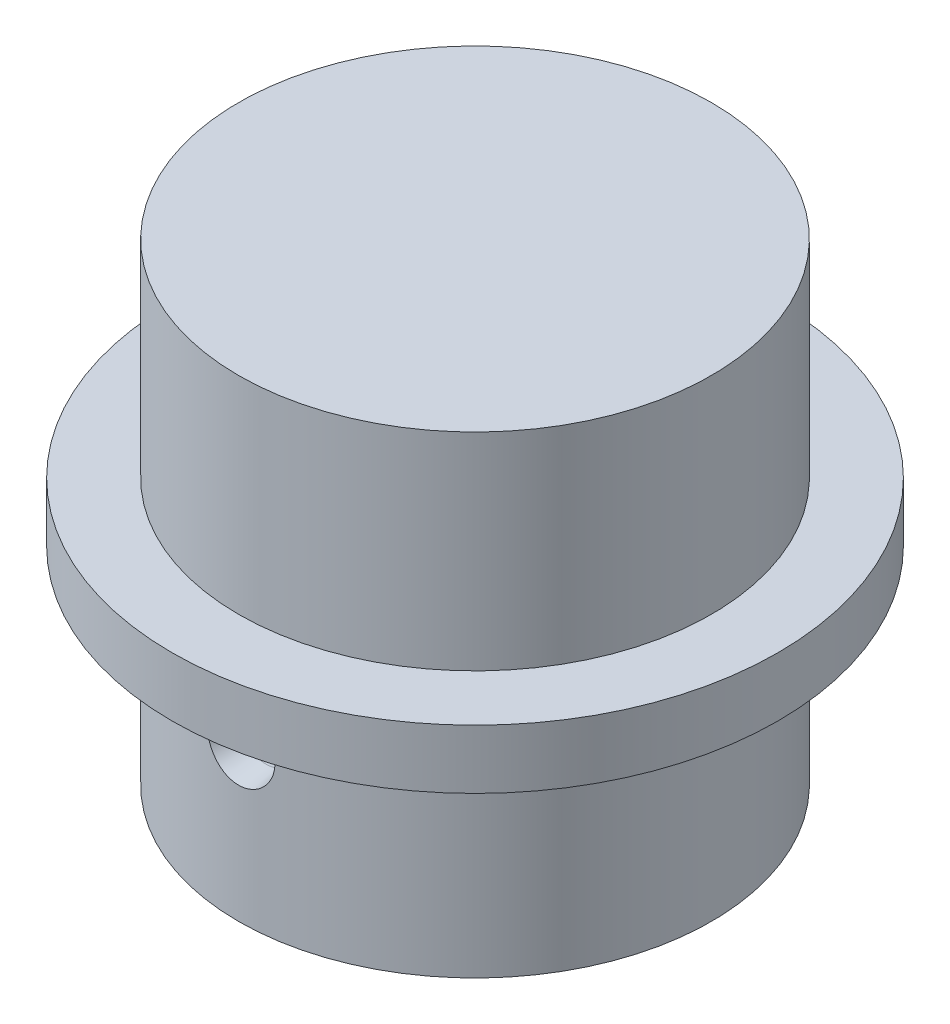
ISO-10303-21;
HEADER;
FILE_DESCRIPTION(('STEP AP214'),'2;1');
FILE_NAME('part.step','',(''),(''),'','','');
FILE_SCHEMA(('AUTOMOTIVE_DESIGN { 1 0 10303 214 1 1 1 1 }'));
ENDSEC;
DATA;
#1=APPLICATION_CONTEXT('core data for automotive mechanical design processes');
#2=APPLICATION_PROTOCOL_DEFINITION('international standard','automotive_design',2000,#1);
#3=PRODUCT_CONTEXT('',#1,'mechanical');
#4=PRODUCT('Part','Part','',(#3));
#5=PRODUCT_RELATED_PRODUCT_CATEGORY('part','',(#4));
#6=PRODUCT_DEFINITION_FORMATION('','',#4);
#7=PRODUCT_DEFINITION_CONTEXT('part definition',#1,'design');
#8=PRODUCT_DEFINITION('design','',#6,#7);
#9=PRODUCT_DEFINITION_SHAPE('','',#8);
#10=(LENGTH_UNIT() NAMED_UNIT(*) SI_UNIT(.MILLI.,.METRE.));
#11=(NAMED_UNIT(*) PLANE_ANGLE_UNIT() SI_UNIT($,.RADIAN.));
#12=(NAMED_UNIT(*) SI_UNIT($,.STERADIAN.) SOLID_ANGLE_UNIT());
#13=UNCERTAINTY_MEASURE_WITH_UNIT(LENGTH_MEASURE(1.E-05),#10,'distance_accuracy_value','');
#14=(GEOMETRIC_REPRESENTATION_CONTEXT(3) GLOBAL_UNCERTAINTY_ASSIGNED_CONTEXT((#13)) GLOBAL_UNIT_ASSIGNED_CONTEXT((#10,
#11,#12)) REPRESENTATION_CONTEXT('',''));
#15=CARTESIAN_POINT('',(0.,0.,0.));
#16=DIRECTION('',(0.,0.,1.));
#17=DIRECTION('',(1.,0.,0.));
#18=AXIS2_PLACEMENT_3D('',#15,#16,#17);
#19=CARTESIAN_POINT('',(0.,0.,0.));
#20=DIRECTION('',(0.,1.,0.));
#21=DIRECTION('',(0.,0.,1.));
#22=AXIS2_PLACEMENT_3D('',#19,#20,#21);
#23=PLANE('',#22);
#24=CARTESIAN_POINT('',(0.,0.,0.));
#25=DIRECTION('',(0.,-1.,0.));
#26=DIRECTION('',(0.,0.,-1.));
#27=AXIS2_PLACEMENT_3D('',#24,#25,#26);
#28=CIRCLE('',#27,3.175);
#29=CARTESIAN_POINT('',(0.,0.,-3.175));
#30=VERTEX_POINT('',#29);
#31=EDGE_CURVE('E62',#30,#30,#28,.T.);
#32=ORIENTED_EDGE('',*,*,#31,.F.);
#33=EDGE_LOOP('',(#32));
#34=FACE_BOUND('',#33,.T.);
#35=CARTESIAN_POINT('',(0.,0.,0.));
#36=DIRECTION('',(0.,-1.,0.));
#37=DIRECTION('',(0.,0.,-1.));
#38=AXIS2_PLACEMENT_3D('',#35,#36,#37);
#39=CIRCLE('',#38,10.0623104662154);
#40=CARTESIAN_POINT('',(0.,0.,-10.0623104662154));
#41=VERTEX_POINT('',#40);
#42=EDGE_CURVE('E59',#41,#41,#39,.T.);
#43=ORIENTED_EDGE('',*,*,#42,.T.);
#44=EDGE_LOOP('',(#43));
#45=FACE_BOUND('',#44,.T.);
#46=ADVANCED_FACE('F30',(#34,#45),#23,.F.);
#47=CARTESIAN_POINT('',(0.,18.5,0.));
#48=DIRECTION('',(0.,-1.,0.));
#49=DIRECTION('',(0.,0.,-1.));
#50=AXIS2_PLACEMENT_3D('',#47,#48,#49);
#51=CYLINDRICAL_SURFACE('',#50,3.175);
#52=CARTESIAN_POINT('',(2.,10.3125154008383,2.46589233341604));
#53=CARTESIAN_POINT('',(1.99999090158307,10.4117032829874,2.46590687164989));
#54=CARTESIAN_POINT('',(1.9925536419842,10.5110380894326,2.47198953142156));
#55=CARTESIAN_POINT('',(1.96334438043011,10.7063364664695,2.49524014742493));
#56=CARTESIAN_POINT('',(1.94153476252968,10.8022904926056,2.5124371904098));
#57=CARTESIAN_POINT('',(1.88515417849698,10.9874086491889,2.55500319811643));
#58=CARTESIAN_POINT('',(1.85069534429532,11.0766243773797,2.58030011523295));
#59=CARTESIAN_POINT('',(1.77032033876273,11.2478902942878,2.63609187757525));
#60=CARTESIAN_POINT('',(1.72440354202476,11.3299400915389,2.6665870065049));
#61=CARTESIAN_POINT('',(1.6151131148495,11.4968606854708,2.73435683466109));
#62=CARTESIAN_POINT('',(1.55021188168997,11.5805866688407,2.77198866486862));
#63=CARTESIAN_POINT('',(1.40791024232801,11.7369361963477,2.84690922798005));
#64=CARTESIAN_POINT('',(1.33049894830133,11.8095499610778,2.88419763183758));
#65=CARTESIAN_POINT('',(1.15382928830773,11.9504900569177,2.9596653628844));
#66=CARTESIAN_POINT('',(1.05305412708492,12.0171843980795,2.99738787005934));
#67=CARTESIAN_POINT('',(0.838882665819289,12.1321300552259,3.06421878624734));
#68=CARTESIAN_POINT('',(0.725499183209441,12.180399883922,3.09333583523651));
#69=CARTESIAN_POINT('',(0.501636542567057,12.2517690385686,3.13697638087595));
#70=CARTESIAN_POINT('',(0.392059062213933,12.2769472949988,3.15269324317928));
#71=CARTESIAN_POINT('',(0.169236171802992,12.3085061781953,3.17245084687623));
#72=CARTESIAN_POINT('',(0.0559948344845473,12.3149069981271,3.17650413113629));
#73=CARTESIAN_POINT('',(-0.154255549185674,12.3089453047981,3.17275329757652));
#74=CARTESIAN_POINT('',(-0.25137383569851,12.2990206917839,3.16648964520068));
#75=CARTESIAN_POINT('',(-0.44224322559198,12.2654130306684,3.14551442421494));
#76=CARTESIAN_POINT('',(-0.535994074117976,12.2417289435417,3.13080221762646));
#77=CARTESIAN_POINT('',(-0.717984024194783,12.1816618989993,3.09415071444281));
#78=CARTESIAN_POINT('',(-0.806212463238677,12.1452552179322,3.07219792074763));
#79=CARTESIAN_POINT('',(-0.975368780987801,12.0611116855888,3.02275640850583));
#80=CARTESIAN_POINT('',(-1.05629503454699,12.0133723206959,2.99526646201054));
#81=CARTESIAN_POINT('',(-1.21943747594383,11.9012144931595,2.93294126085738));
#82=CARTESIAN_POINT('',(-1.30054359212299,11.8354553663378,2.89761720617172));
#83=CARTESIAN_POINT('',(-1.4512799603457,11.6925854564407,2.82514149894608));
#84=CARTESIAN_POINT('',(-1.52089302720385,11.615457994811,2.78798721551571));
#85=CARTESIAN_POINT('',(-1.65612458954927,11.4399542181254,2.71011707591775));
#86=CARTESIAN_POINT('',(-1.7199689069034,11.3401157590391,2.66958799068782));
#87=CARTESIAN_POINT('',(-1.82974873770082,11.1286896611803,2.59558100723155));
#88=CARTESIAN_POINT('',(-1.87571709410986,11.0171240522161,2.56209023028312));
#89=CARTESIAN_POINT('',(-1.93775638466416,10.8155761365987,2.51531617850959));
#90=CARTESIAN_POINT('',(-1.95852685715628,10.7277421793345,2.49902766236284));
#91=CARTESIAN_POINT('',(-1.98803686574072,10.5489287438127,2.47562154575213));
#92=CARTESIAN_POINT('',(-1.99679334625848,10.4579538816259,2.46849102983714));
#93=CARTESIAN_POINT('',(-2.0017450649925,10.2752000944506,2.46447872389607));
#94=CARTESIAN_POINT('',(-1.9979089407605,10.1834197305456,2.46762252242586));
#95=CARTESIAN_POINT('',(-1.97786837759876,10.0020718393569,2.48371009581809));
#96=CARTESIAN_POINT('',(-1.96165364262213,9.91250621826738,2.49666202863283));
#97=CARTESIAN_POINT('',(-1.91822272714689,9.73961037781703,2.53017198569149));
#98=CARTESIAN_POINT('',(-1.89123132126453,9.65619167500208,2.55057392081974));
#99=CARTESIAN_POINT('',(-1.82729727674056,9.49488353944391,2.5967598628512));
#100=CARTESIAN_POINT('',(-1.79035113558979,9.41699606503851,2.62254576334767));
#101=CARTESIAN_POINT('',(-1.69940280298898,9.25306980877617,2.68256552397718));
#102=CARTESIAN_POINT('',(-1.64348767446577,9.16833841888035,2.71747074073631));
#103=CARTESIAN_POINT('',(-1.51980983064632,9.00851981547858,2.78853043345476));
#104=CARTESIAN_POINT('',(-1.45203469497722,8.93344285698861,2.82468618686872));
#105=CARTESIAN_POINT('',(-1.29321556579375,8.78231261437306,2.90124443899629));
#106=CARTESIAN_POINT('',(-1.20017608365051,8.70818166601195,2.94135053658763));
#107=CARTESIAN_POINT('',(-1.00058271415417,8.57669034682025,3.01508805876786));
#108=CARTESIAN_POINT('',(-0.894034531255205,8.51932293068337,3.04872220132707));
#109=CARTESIAN_POINT('',(-0.67623708714338,8.42680915100608,3.10406504559704));
#110=CARTESIAN_POINT('',(-0.565593936901231,8.39059007984937,3.12634034643211));
#111=CARTESIAN_POINT('',(-0.338072588277098,8.3378541448309,3.15903052520699));
#112=CARTESIAN_POINT('',(-0.221203601178509,8.32130897477393,3.16946244205744));
#113=CARTESIAN_POINT('',(-0.00370360004249617,8.3100116514602,3.17657698775842));
#114=CARTESIAN_POINT('',(0.0967285763712691,8.31235836659522,3.17509009682145));
#115=CARTESIAN_POINT('',(0.295535142234609,8.33195275440309,3.16278250971577));
#116=CARTESIAN_POINT('',(0.393909654215256,8.34919953719533,3.1519623709591));
#117=CARTESIAN_POINT('',(0.582044526850574,8.39671706302812,3.12259148430048));
#118=CARTESIAN_POINT('',(0.671990954202438,8.42645746489716,3.10435640474158));
#119=CARTESIAN_POINT('',(0.845521369570051,8.49760638884402,3.06165173262775));
#120=CARTESIAN_POINT('',(0.929104330608651,8.53901678925258,3.03718113650346));
#121=CARTESIAN_POINT('',(1.09682917033282,8.63700199762312,2.98097204520092));
#122=CARTESIAN_POINT('',(1.18015114141815,8.69469570779205,2.9487458132924));
#123=CARTESIAN_POINT('',(1.33651724175415,8.82125479894321,2.88125249547953));
#124=CARTESIAN_POINT('',(1.40954977073001,8.89013260354627,2.84598204861994));
#125=CARTESIAN_POINT('',(1.55440775753217,9.0487904227358,2.7698507855398));
#126=CARTESIAN_POINT('',(1.62447501319413,9.14015475562038,2.7289308928647));
#127=CARTESIAN_POINT('',(1.7485450697099,9.33482126934138,2.65114675676971));
#128=CARTESIAN_POINT('',(1.8025556585872,9.43811762887281,2.61428055266027));
#129=CARTESIAN_POINT('',(1.88266715338775,9.63134658333475,2.55696429777707));
#130=CARTESIAN_POINT('',(1.91228650728714,9.71927659952446,2.53468748304013));
#131=CARTESIAN_POINT('',(1.95918298190396,9.89990912632007,2.49862393814564));
#132=CARTESIAN_POINT('',(1.97649846504645,9.99259582820074,2.48481083755828));
#133=CARTESIAN_POINT('',(1.99143909378843,10.1238416748558,2.4728157656299));
#134=CARTESIAN_POINT('',(1.99464365408458,10.1614474325582,2.47022888515031));
#135=CARTESIAN_POINT('',(1.99892612529295,10.2368667661076,2.46676416897308));
#136=CARTESIAN_POINT('',(2.00000347057175,10.2746803945485,2.46588678783771));
#137=CARTESIAN_POINT('',(2.,10.3125154008383,2.46589233341604));
#138=B_SPLINE_CURVE_WITH_KNOTS('',3,(#52,#53,#54,#55,#56,#57,#58,#59,#60,#61,#62,#63,#64,#65,
#66,#67,#68,#69,#70,#71,#72,#73,#74,#75,#76,#77,#78,#79,#80,#81,#82,#83,#84,#85,#86,#87,#88,#89,
#90,#91,#92,#93,#94,#95,#96,#97,#98,#99,#100,#101,#102,#103,#104,#105,#106,#107,#108,#109,#110,
#111,#112,#113,#114,#115,#116,#117,#118,#119,#120,#121,#122,#123,#124,#125,#126,#127,#128,#129,
#130,#131,#132,#133,#134,#135,#136,#137),.UNSPECIFIED.,.T.,.F.,(4,2,2,2,2,2,2,2,2,2,2,2,2,2,2,2,
2,2,2,2,2,2,2,2,2,2,2,2,2,2,2,2,2,2,2,2,2,2,2,2,2,2,4),(0.,0.297390063211998,0.595561576120619,
0.891151308846726,1.18675717920223,1.52272996686637,1.85899675073441,2.23671629365682,
2.61405530348635,2.95256646392934,3.29071345739769,3.58278352564361,3.87487565197759,
4.16751537076875,4.46022005850385,4.78961837931241,5.11950486335608,5.49343471910718,
5.86667428178835,6.14067589769239,6.41429066555722,6.68858739981657,6.96311253233839,
7.23218817708664,7.50135861826526,7.82222461620282,8.14342867377716,8.51816120636343,
8.89273602068741,9.24613904454614,9.59903298554898,9.89889959611244,10.1987482989024,
10.486982759039,10.7752636381332,11.0930768355032,11.4112455151164,11.7762214928024,
12.1410201549523,12.4262141773566,12.7105150401276,12.8239236943697,12.9373625002841),.UNSPECIFIED.);
#139=CARTESIAN_POINT('',(2.,10.3125154008383,2.46589233341604));
#140=VERTEX_POINT('',#139);
#141=EDGE_CURVE('E85',#140,#140,#138,.T.);
#142=ORIENTED_EDGE('',*,*,#141,.T.);
#143=EDGE_LOOP('',(#142));
#144=FACE_BOUND('',#143,.T.);
#145=CARTESIAN_POINT('',(0.,14.,0.));
#146=DIRECTION('',(0.,-1.,0.));
#147=DIRECTION('',(0.,0.,-1.));
#148=AXIS2_PLACEMENT_3D('',#145,#146,#147);
#149=CIRCLE('',#148,3.175);
#150=CARTESIAN_POINT('',(0.,14.,-3.175));
#151=VERTEX_POINT('',#150);
#152=EDGE_CURVE('E48',#151,#151,#149,.F.);
#153=ORIENTED_EDGE('',*,*,#152,.T.);
#154=EDGE_LOOP('',(#153));
#155=FACE_BOUND('',#154,.T.);
#156=ORIENTED_EDGE('',*,*,#31,.T.);
#157=EDGE_LOOP('',(#156));
#158=FACE_BOUND('',#157,.T.);
#159=ADVANCED_FACE('F97',(#144,#155,#158),#51,.F.);
#160=CARTESIAN_POINT('',(0.,0.,0.));
#161=DIRECTION('',(0.,1.,0.));
#162=DIRECTION('',(0.,0.,1.));
#163=AXIS2_PLACEMENT_3D('',#160,#161,#162);
#164=CONICAL_SURFACE('',#163,10.0623104662154,0.469737283001168);
#165=CARTESIAN_POINT('',(0.,2.05994526545085,0.));
#166=DIRECTION('',(0.,-1.,0.));
#167=DIRECTION('',(0.,0.,-1.));
#168=AXIS2_PLACEMENT_3D('',#165,#166,#167);
#169=CIRCLE('',#168,11.1080116782349);
#170=CARTESIAN_POINT('',(0.,2.05994526545085,-11.1080116782349));
#171=VERTEX_POINT('',#170);
#172=EDGE_CURVE('E56',#171,#171,#169,.T.);
#173=ORIENTED_EDGE('',*,*,#172,.T.);
#174=EDGE_LOOP('',(#173));
#175=FACE_BOUND('',#174,.T.);
#176=ORIENTED_EDGE('',*,*,#42,.F.);
#177=EDGE_LOOP('',(#176));
#178=FACE_BOUND('',#177,.T.);
#179=ADVANCED_FACE('F131',(#175,#178),#164,.T.);
#180=CARTESIAN_POINT('',(-12.6622117507312,2.05994526545085,0.));
#181=DIRECTION('',(0.,-1.,0.));
#182=DIRECTION('',(0.,0.,-1.));
#183=AXIS2_PLACEMENT_3D('',#180,#181,#182);
#184=PLANE('',#183);
#185=CARTESIAN_POINT('',(0.,2.05994526545085,0.));
#186=DIRECTION('',(0.,-1.,0.));
#187=DIRECTION('',(0.,0.,-1.));
#188=AXIS2_PLACEMENT_3D('',#185,#186,#187);
#189=CIRCLE('',#188,12.6622117507312);
#190=CARTESIAN_POINT('',(0.,2.05994526545085,-12.6622117507312));
#191=VERTEX_POINT('',#190);
#192=EDGE_CURVE('E53',#191,#191,#189,.T.);
#193=ORIENTED_EDGE('',*,*,#192,.T.);
#194=EDGE_LOOP('',(#193));
#195=FACE_BOUND('',#194,.T.);
#196=ORIENTED_EDGE('',*,*,#172,.F.);
#197=EDGE_LOOP('',(#196));
#198=FACE_BOUND('',#197,.T.);
#199=ADVANCED_FACE('F127',(#195,#198),#184,.T.);
#200=CARTESIAN_POINT('',(0.,2.05994526545085,0.));
#201=DIRECTION('',(0.,-1.,0.));
#202=DIRECTION('',(0.,0.,-1.));
#203=AXIS2_PLACEMENT_3D('',#200,#201,#202);
#204=CONICAL_SURFACE('',#203,12.6622117507312,0.469737283001168);
#205=CARTESIAN_POINT('',(0.,0.,0.));
#206=DIRECTION('',(0.,-1.,0.));
#207=DIRECTION('',(0.,0.,-1.));
#208=AXIS2_PLACEMENT_3D('',#205,#206,#207);
#209=CIRCLE('',#208,13.7079129627507);
#210=CARTESIAN_POINT('',(0.,0.,-13.7079129627507));
#211=VERTEX_POINT('',#210);
#212=EDGE_CURVE('E50',#211,#211,#209,.T.);
#213=ORIENTED_EDGE('',*,*,#212,.T.);
#214=EDGE_LOOP('',(#213));
#215=FACE_BOUND('',#214,.T.);
#216=ORIENTED_EDGE('',*,*,#192,.F.);
#217=EDGE_LOOP('',(#216));
#218=FACE_BOUND('',#217,.T.);
#219=ADVANCED_FACE('F124',(#215,#218),#204,.F.);
#220=CARTESIAN_POINT('',(0.,32.,0.));
#221=DIRECTION('',(0.,-1.,0.));
#222=DIRECTION('',(0.,0.,-1.));
#223=AXIS2_PLACEMENT_3D('',#220,#221,#222);
#224=CYLINDRICAL_SURFACE('',#223,16.);
#225=CARTESIAN_POINT('',(-1.65195734963892,8.69998343853853,15.9144924404232));
#226=CARTESIAN_POINT('',(-1.74204692512049,8.79464419752827,15.9051412894467));
#227=CARTESIAN_POINT('',(-1.82415180556339,8.89702592308028,15.8958437085205));
#228=CARTESIAN_POINT('',(-1.97009440478788,9.11427258608946,15.8784178223834));
#229=CARTESIAN_POINT('',(-2.03391170292494,9.22915128228723,15.8702908292931));
#230=CARTESIAN_POINT('',(-2.14144894402352,9.46802622387624,15.8561392165658));
#231=CARTESIAN_POINT('',(-2.18517830194597,9.59201816633094,15.8501136123543));
#232=CARTESIAN_POINT('',(-2.25135990685449,9.84562019154463,15.8408492748912));
#233=CARTESIAN_POINT('',(-2.27381768551435,9.97522880451522,15.8376098171224));
#234=CARTESIAN_POINT('',(-2.29685257460854,10.2364318260563,15.8342858219779));
#235=CARTESIAN_POINT('',(-2.29742729577466,10.3680264498971,15.834201629105));
#236=CARTESIAN_POINT('',(-2.27667240684447,10.6294451499143,15.8371989075896));
#237=CARTESIAN_POINT('',(-2.25534185051292,10.75926914936,15.8402805156992));
#238=CARTESIAN_POINT('',(-2.19141031305248,11.0133019632145,15.8492508033695));
#239=CARTESIAN_POINT('',(-2.14883458843967,11.1375172545702,15.8551361494368));
#240=CARTESIAN_POINT('',(-2.04359318620363,11.3769986488838,15.8690431050322));
#241=CARTESIAN_POINT('',(-1.98092688415421,11.4922644735491,15.8770647809573));
#242=CARTESIAN_POINT('',(-1.83705317417591,11.7108101250401,15.8943536359504));
#243=CARTESIAN_POINT('',(-1.75580892250912,11.8140655105103,15.9036232747468));
#244=CARTESIAN_POINT('',(-1.57704002008389,12.0053528414912,15.9223428211393));
#245=CARTESIAN_POINT('',(-1.47951552963539,12.0933849368868,15.9317927269596));
#246=CARTESIAN_POINT('',(-1.271307001253,12.2512629290043,15.9497532798374));
#247=CARTESIAN_POINT('',(-1.16068242192586,12.3211867288539,15.9582678564305));
#248=CARTESIAN_POINT('',(-0.929025864225397,12.4411849162277,15.9734267320142));
#249=CARTESIAN_POINT('',(-0.807994992849555,12.4912614118912,15.9800712296189));
#250=CARTESIAN_POINT('',(-0.561081285738191,12.5692974944526,15.9906283972019));
#251=CARTESIAN_POINT('',(-0.435311028844125,12.5976073832672,15.9945842113605));
#252=CARTESIAN_POINT('',(-0.180740249940321,12.6325324982241,15.9994852519815));
#253=CARTESIAN_POINT('',(-0.0519400606010009,12.6391500949706,16.0004308074145));
#254=CARTESIAN_POINT('',(0.202866914360157,12.6305452661604,15.9992133305527));
#255=CARTESIAN_POINT('',(0.328885691005478,12.6156661096321,15.9970991563603));
#256=CARTESIAN_POINT('',(0.576610964234381,12.5651684512705,15.9900869625934));
#257=CARTESIAN_POINT('',(0.698317471703788,12.5295500017952,15.985188950047));
#258=CARTESIAN_POINT('',(0.934183416179216,12.4386332583061,15.9731423722674));
#259=CARTESIAN_POINT('',(1.0483334987149,12.3833110930874,15.9659910783837));
#260=CARTESIAN_POINT('',(1.26586960168504,12.2546526059732,15.9502189725932));
#261=CARTESIAN_POINT('',(1.3692546872751,12.1813147214271,15.9415980332318));
#262=CARTESIAN_POINT('',(1.56419497200615,12.0173546890209,15.9236632441902));
#263=CARTESIAN_POINT('',(1.65552357612654,11.9264641502948,15.9143402218282));
#264=CARTESIAN_POINT('',(1.82189358709873,11.7307908063594,15.8961544282919));
#265=CARTESIAN_POINT('',(1.89693360327105,11.6260068161908,15.8872916964653));
#266=CARTESIAN_POINT('',(2.02979938111568,11.4037110637918,15.8708689819296));
#267=CARTESIAN_POINT('',(2.08733968564969,11.286026900715,15.8633313701758));
#268=CARTESIAN_POINT('',(2.18204959836209,11.0426104398422,15.8505822193394));
#269=CARTESIAN_POINT('',(2.21921893366017,10.9168780342609,15.8453707114165));
#270=CARTESIAN_POINT('',(2.27226017531859,10.6604414426166,15.8378522226364));
#271=CARTESIAN_POINT('',(2.28805552818027,10.5297211006837,15.8355556839036));
#272=CARTESIAN_POINT('',(2.29765567245861,10.2674595034125,15.8341657044783));
#273=CARTESIAN_POINT('',(2.29146064399629,10.1359182548069,15.8350722375496));
#274=CARTESIAN_POINT('',(2.25728868666391,9.87601483725518,15.8399791365443));
#275=CARTESIAN_POINT('',(2.22935366975131,9.74764704106822,15.8439735493261));
#276=CARTESIAN_POINT('',(2.15252815938861,9.49745608362193,15.8545928482001));
#277=CARTESIAN_POINT('',(2.10363711426369,9.37563309475197,15.861217803542));
#278=CARTESIAN_POINT('',(1.9861502457719,9.14179891540422,15.8763567621105));
#279=CARTESIAN_POINT('',(1.91752631703862,9.02980201920081,15.8848734557579));
#280=CARTESIAN_POINT('',(1.76245236250457,8.8189911678096,15.9028247454267));
#281=CARTESIAN_POINT('',(1.67600199483411,8.7201774655047,15.9122593590499));
#282=CARTESIAN_POINT('',(1.48768338816359,8.53866872235918,15.9309674691918));
#283=CARTESIAN_POINT('',(1.38582745140982,8.45596093948641,15.9402410877454));
#284=CARTESIAN_POINT('',(1.1694451162284,8.30905590611743,15.9575736040988));
#285=CARTESIAN_POINT('',(1.05491966051321,8.2448572796737,15.9656325921713));
#286=CARTESIAN_POINT('',(0.817973079235903,8.13768170241322,15.9795121948939));
#287=CARTESIAN_POINT('',(0.695671526092158,8.09444409551065,15.9853600922765));
#288=CARTESIAN_POINT('',(0.445409458884269,8.02938003913665,15.9942886580525));
#289=CARTESIAN_POINT('',(0.317449839758643,8.00755021615828,15.9973697624394));
#290=CARTESIAN_POINT('',(0.0620186541003079,7.98621844782768,16.0003803011936));
#291=CARTESIAN_POINT('',(-0.0654187862722445,7.98631416187563,16.0003665276486));
#292=CARTESIAN_POINT('',(-0.318467398237261,8.00782852637409,15.9973307550884));
#293=CARTESIAN_POINT('',(-0.444078274298231,8.02925058924677,15.994308274651));
#294=CARTESIAN_POINT('',(-0.689209260266486,8.09255460996771,15.9856176100943));
#295=CARTESIAN_POINT('',(-0.808757945248906,8.13432829969898,15.979963433298));
#296=CARTESIAN_POINT('',(-1.03912798919701,8.23697936272043,15.9666376002674));
#297=CARTESIAN_POINT('',(-1.14995725409458,8.29783917491294,15.9589677996507));
#298=CARTESIAN_POINT('',(-1.32714246342639,8.41506558265222,15.9450293875815));
#299=CARTESIAN_POINT('',(-1.39657406936771,8.4668942111238,15.9390717826984));
#300=CARTESIAN_POINT('',(-1.52915648537072,8.57801464575583,15.926899106791));
#301=CARTESIAN_POINT('',(-1.59230717785504,8.63730659158096,15.9206840309501));
#302=CARTESIAN_POINT('',(-1.65195734963892,8.69998343853853,15.9144924404232));
#303=B_SPLINE_CURVE_WITH_KNOTS('',3,(#225,#226,#227,#228,#229,#230,#231,#232,#233,#234,#235,
#236,#237,#238,#239,#240,#241,#242,#243,#244,#245,#246,#247,#248,#249,#250,#251,#252,#253,#254,
#255,#256,#257,#258,#259,#260,#261,#262,#263,#264,#265,#266,#267,#268,#269,#270,#271,#272,#273,
#274,#275,#276,#277,#278,#279,#280,#281,#282,#283,#284,#285,#286,#287,#288,#289,#290,#291,#292,
#293,#294,#295,#296,#297,#298,#299,#300,#301,#302),.UNSPECIFIED.,.T.,.F.,(4,2,2,2,2,2,2,2,2,2,2,
2,2,2,2,2,2,2,2,2,2,2,2,2,2,2,2,2,2,2,2,2,2,2,2,2,2,2,4),(0.,0.392720562667772,
0.785877959050317,1.17885089910557,1.57172161847539,1.96463523271151,2.3575658202247,
2.75003039595333,3.14250717087931,3.53576916095807,3.9290272788524,4.32056436188468,
4.71205984550977,5.09711466244529,5.48212739793548,5.8610596253457,6.23999089611714,
6.61938281544437,6.99880765416139,7.38457392333394,7.77037311533598,8.16216419411004,
8.55396052101227,8.94715643219265,9.34034912275185,9.73278565951398,10.1252325279408,
10.5182411472219,10.9112573041962,11.3039612558826,11.6966360069171,12.0842938078788,
12.4718905106656,12.852375270609,13.2329209215826,13.6114638653556,13.9896595294764,
14.2496830723191,14.5097114818324),.UNSPECIFIED.);
#304=CARTESIAN_POINT('',(-1.65195734963892,8.69998343853853,15.9144924404232));
#305=VERTEX_POINT('',#304);
#306=EDGE_CURVE('E93',#305,#305,#303,.T.);
#307=ORIENTED_EDGE('',*,*,#306,.T.);
#308=EDGE_LOOP('',(#307));
#309=FACE_BOUND('',#308,.T.);
#310=CARTESIAN_POINT('',(0.,14.,0.));
#311=DIRECTION('',(0.,-1.,0.));
#312=DIRECTION('',(0.,0.,-1.));
#313=AXIS2_PLACEMENT_3D('',#310,#311,#312);
#314=CIRCLE('',#313,16.);
#315=CARTESIAN_POINT('',(0.,14.,-16.));
#316=VERTEX_POINT('',#315);
#317=EDGE_CURVE('E73',#316,#316,#314,.T.);
#318=ORIENTED_EDGE('',*,*,#317,.T.);
#319=EDGE_LOOP('',(#318));
#320=FACE_BOUND('',#319,.T.);
#321=CARTESIAN_POINT('',(0.,0.,0.));
#322=DIRECTION('',(0.,1.,0.));
#323=DIRECTION('',(0.,0.,1.));
#324=AXIS2_PLACEMENT_3D('',#321,#322,#323);
#325=CIRCLE('',#324,16.);
#326=CARTESIAN_POINT('',(0.,0.,16.));
#327=VERTEX_POINT('',#326);
#328=EDGE_CURVE('E66',#327,#327,#325,.T.);
#329=ORIENTED_EDGE('',*,*,#328,.T.);
#330=EDGE_LOOP('',(#329));
#331=FACE_BOUND('',#330,.T.);
#332=ADVANCED_FACE('F32',(#309,#320,#331),#224,.T.);
#333=ORIENTED_EDGE('',*,*,#328,.F.);
#334=EDGE_LOOP('',(#333));
#335=FACE_BOUND('',#334,.T.);
#336=ORIENTED_EDGE('',*,*,#212,.F.);
#337=EDGE_LOOP('',(#336));
#338=FACE_BOUND('',#337,.T.);
#339=ADVANCED_FACE('F123',(#335,#338),#23,.F.);
#340=CARTESIAN_POINT('',(0.,18.,0.));
#341=DIRECTION('',(0.,-1.,0.));
#342=DIRECTION('',(0.,0.,-1.));
#343=AXIS2_PLACEMENT_3D('',#340,#341,#342);
#344=CYLINDRICAL_SURFACE('',#343,20.5);
#345=CARTESIAN_POINT('',(0.,18.,0.));
#346=DIRECTION('',(0.,-1.,0.));
#347=DIRECTION('',(0.,0.,-1.));
#348=AXIS2_PLACEMENT_3D('',#345,#346,#347);
#349=CIRCLE('',#348,20.5);
#350=CARTESIAN_POINT('',(0.,18.,-20.5));
#351=VERTEX_POINT('',#350);
#352=EDGE_CURVE('E75',#351,#351,#349,.T.);
#353=ORIENTED_EDGE('',*,*,#352,.T.);
#354=EDGE_LOOP('',(#353));
#355=FACE_BOUND('',#354,.T.);
#356=CARTESIAN_POINT('',(0.,14.,0.));
#357=DIRECTION('',(0.,-1.,0.));
#358=DIRECTION('',(0.,0.,-1.));
#359=AXIS2_PLACEMENT_3D('',#356,#357,#358);
#360=CIRCLE('',#359,20.5);
#361=CARTESIAN_POINT('',(0.,14.,-20.5));
#362=VERTEX_POINT('',#361);
#363=EDGE_CURVE('E80',#362,#362,#360,.T.);
#364=ORIENTED_EDGE('',*,*,#363,.F.);
#365=EDGE_LOOP('',(#364));
#366=FACE_BOUND('',#365,.T.);
#367=ADVANCED_FACE('F120',(#355,#366),#344,.T.);
#368=CARTESIAN_POINT('',(0.,14.,0.));
#369=DIRECTION('',(0.,-1.,0.));
#370=DIRECTION('',(0.,0.,-1.));
#371=AXIS2_PLACEMENT_3D('',#368,#369,#370);
#372=PLANE('',#371);
#373=ORIENTED_EDGE('',*,*,#363,.T.);
#374=EDGE_LOOP('',(#373));
#375=FACE_BOUND('',#374,.T.);
#376=ORIENTED_EDGE('',*,*,#317,.F.);
#377=EDGE_LOOP('',(#376));
#378=FACE_BOUND('',#377,.T.);
#379=ADVANCED_FACE('F119',(#375,#378),#372,.T.);
#380=CARTESIAN_POINT('',(0.,18.,0.));
#381=DIRECTION('',(0.,-1.,0.));
#382=DIRECTION('',(0.,0.,-1.));
#383=AXIS2_PLACEMENT_3D('',#380,#381,#382);
#384=PLANE('',#383);
#385=ORIENTED_EDGE('',*,*,#352,.F.);
#386=EDGE_LOOP('',(#385));
#387=FACE_BOUND('',#386,.T.);
#388=CARTESIAN_POINT('',(0.,18.,0.));
#389=DIRECTION('',(0.,-1.,0.));
#390=DIRECTION('',(0.,0.,-1.));
#391=AXIS2_PLACEMENT_3D('',#388,#389,#390);
#392=CIRCLE('',#391,16.);
#393=CARTESIAN_POINT('',(0.,18.,-16.));
#394=VERTEX_POINT('',#393);
#395=EDGE_CURVE('E40',#394,#394,#392,.T.);
#396=ORIENTED_EDGE('',*,*,#395,.T.);
#397=EDGE_LOOP('',(#396));
#398=FACE_BOUND('',#397,.T.);
#399=ADVANCED_FACE('F113',(#387,#398),#384,.F.);
#400=CARTESIAN_POINT('',(0.,32.,0.));
#401=DIRECTION('',(0.,1.,0.));
#402=DIRECTION('',(0.,0.,1.));
#403=AXIS2_PLACEMENT_3D('',#400,#401,#402);
#404=PLANE('',#403);
#405=CARTESIAN_POINT('',(0.,32.,0.));
#406=DIRECTION('',(0.,1.,0.));
#407=DIRECTION('',(0.,0.,1.));
#408=AXIS2_PLACEMENT_3D('',#405,#406,#407);
#409=CIRCLE('',#408,16.);
#410=CARTESIAN_POINT('',(0.,32.,16.));
#411=VERTEX_POINT('',#410);
#412=EDGE_CURVE('E45',#411,#411,#409,.T.);
#413=ORIENTED_EDGE('',*,*,#412,.T.);
#414=EDGE_LOOP('',(#413));
#415=FACE_BOUND('',#414,.T.);
#416=ADVANCED_FACE('F181',(#415),#404,.T.);
#417=ORIENTED_EDGE('',*,*,#412,.F.);
#418=EDGE_LOOP('',(#417));
#419=FACE_BOUND('',#418,.T.);
#420=ORIENTED_EDGE('',*,*,#395,.F.);
#421=EDGE_LOOP('',(#420));
#422=FACE_BOUND('',#421,.T.);
#423=ADVANCED_FACE('F117',(#419,#422),#224,.T.);
#424=ORIENTED_EDGE('',*,*,#152,.F.);
#425=EDGE_LOOP('',(#424));
#426=FACE_BOUND('',#425,.T.);
#427=ADVANCED_FACE('F106',(#426),#372,.T.);
#428=CARTESIAN_POINT('',(0.,10.3125154008383,0.));
#429=DIRECTION('',(0.,0.,1.));
#430=DIRECTION('',(1.,0.,0.));
#431=AXIS2_PLACEMENT_3D('',#428,#429,#430);
#432=CYLINDRICAL_SURFACE('',#431,2.);
#433=CARTESIAN_POINT('',(0.,10.3125154008383,14.1648344912278));
#434=DIRECTION('',(0.,0.,1.));
#435=DIRECTION('',(1.,0.,0.));
#436=AXIS2_PLACEMENT_3D('',#433,#434,#435);
#437=CIRCLE('',#436,2.);
#438=CARTESIAN_POINT('',(2.,10.3125154008383,14.1648344912278));
#439=VERTEX_POINT('',#438);
#440=EDGE_CURVE('E35',#439,#439,#437,.T.);
#441=ORIENTED_EDGE('',*,*,#440,.T.);
#442=EDGE_LOOP('',(#441));
#443=FACE_BOUND('',#442,.T.);
#444=ORIENTED_EDGE('',*,*,#141,.F.);
#445=EDGE_LOOP('',(#444));
#446=FACE_BOUND('',#445,.T.);
#447=ADVANCED_FACE('F101',(#443,#446),#432,.F.);
#448=CARTESIAN_POINT('',(0.,10.3125154008383,19.));
#449=DIRECTION('',(0.,0.,1.));
#450=DIRECTION('',(1.,0.,0.));
#451=AXIS2_PLACEMENT_3D('',#448,#449,#450);
#452=CONICAL_SURFACE('',#451,2.85257013538751,0.174532925199433);
#453=ORIENTED_EDGE('',*,*,#440,.F.);
#454=EDGE_LOOP('',(#453));
#455=FACE_BOUND('',#454,.T.);
#456=ORIENTED_EDGE('',*,*,#306,.F.);
#457=EDGE_LOOP('',(#456));
#458=FACE_BOUND('',#457,.T.);
#459=ADVANCED_FACE('F105',(#455,#458),#452,.F.);
#460=CLOSED_SHELL('',(#46,#159,#179,#199,#219,#332,#339,#367,#379,#399,#416,#423,#427,#447,#459));
#461=CARTESIAN_POINT('',(0.,18.,0.));
#462=DIRECTION('',(0.,-1.,0.));
#463=DIRECTION('',(0.,0.,-1.));
#464=AXIS2_PLACEMENT_3D('',#461,#462,#463);
#465=CIRCLE('',#464,3.175);
#466=CARTESIAN_POINT('',(0.,18.,-3.175));
#467=VERTEX_POINT('',#466);
#468=EDGE_CURVE('E10',#467,#467,#465,.F.);
#469=ORIENTED_EDGE('',*,*,#468,.T.);
#470=EDGE_LOOP('',(#469));
#471=FACE_BOUND('',#470,.T.);
#472=ADVANCED_FACE('F109',(#471),#384,.F.);
#473=CARTESIAN_POINT('',(0.,18.5,0.));
#474=DIRECTION('',(0.,-1.,0.));
#475=DIRECTION('',(0.,0.,-1.));
#476=AXIS2_PLACEMENT_3D('',#473,#474,#475);
#477=PLANE('',#476);
#478=CARTESIAN_POINT('',(0.,18.5,0.));
#479=DIRECTION('',(0.,-1.,0.));
#480=DIRECTION('',(0.,0.,-1.));
#481=AXIS2_PLACEMENT_3D('',#478,#479,#480);
#482=CIRCLE('',#481,3.175);
#483=CARTESIAN_POINT('',(0.,18.5,-3.175));
#484=VERTEX_POINT('',#483);
#485=EDGE_CURVE('E63',#484,#484,#482,.T.);
#486=ORIENTED_EDGE('',*,*,#485,.T.);
#487=EDGE_LOOP('',(#486));
#488=FACE_BOUND('',#487,.T.);
#489=ADVANCED_FACE('F112',(#488),#477,.T.);
#490=ORIENTED_EDGE('',*,*,#485,.F.);
#491=EDGE_LOOP('',(#490));
#492=FACE_BOUND('',#491,.T.);
#493=ORIENTED_EDGE('',*,*,#468,.F.);
#494=EDGE_LOOP('',(#493));
#495=FACE_BOUND('',#494,.T.);
#496=ADVANCED_FACE('F136',(#492,#495),#51,.F.);
#497=CLOSED_SHELL('',(#472,#489,#496));
#498=ORIENTED_CLOSED_SHELL('',*,#497,.T.);
#499=BREP_WITH_VOIDS('B2',#460,(#498));
#500=ADVANCED_BREP_SHAPE_REPRESENTATION('',(#18,#499),#14);
#501=SHAPE_DEFINITION_REPRESENTATION(#9,#500);
ENDSEC;
END-ISO-10303-21;
